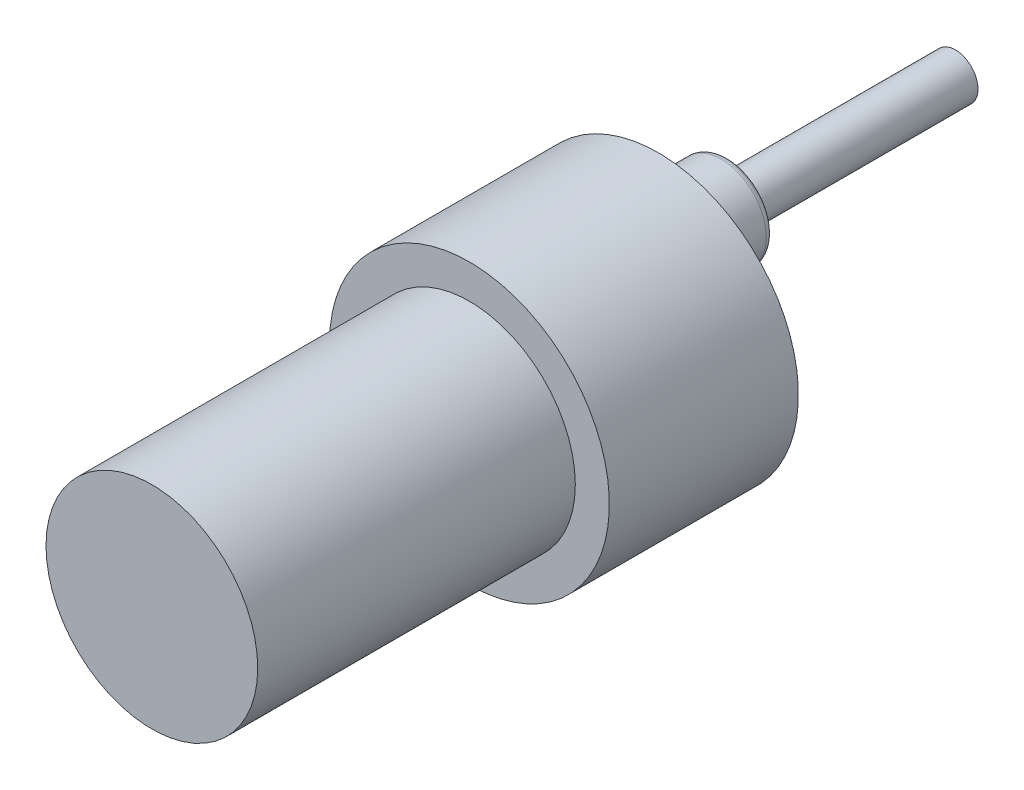
ISO-10303-21;
HEADER;
FILE_DESCRIPTION(('STEP AP214'),'2;1');
FILE_NAME('part.step','',(''),(''),'','','');
FILE_SCHEMA(('AUTOMOTIVE_DESIGN { 1 0 10303 214 1 1 1 1 }'));
ENDSEC;
DATA;
#1=APPLICATION_CONTEXT('core data for automotive mechanical design processes');
#2=APPLICATION_PROTOCOL_DEFINITION('international standard','automotive_design',2000,#1);
#3=PRODUCT_CONTEXT('',#1,'mechanical');
#4=PRODUCT('Part','Part','',(#3));
#5=PRODUCT_RELATED_PRODUCT_CATEGORY('part','',(#4));
#6=PRODUCT_DEFINITION_FORMATION('','',#4);
#7=PRODUCT_DEFINITION_CONTEXT('part definition',#1,'design');
#8=PRODUCT_DEFINITION('design','',#6,#7);
#9=PRODUCT_DEFINITION_SHAPE('','',#8);
#10=(LENGTH_UNIT() NAMED_UNIT(*) SI_UNIT(.MILLI.,.METRE.));
#11=(NAMED_UNIT(*) PLANE_ANGLE_UNIT() SI_UNIT($,.RADIAN.));
#12=(NAMED_UNIT(*) SI_UNIT($,.STERADIAN.) SOLID_ANGLE_UNIT());
#13=UNCERTAINTY_MEASURE_WITH_UNIT(LENGTH_MEASURE(1.E-05),#10,'distance_accuracy_value','');
#14=(GEOMETRIC_REPRESENTATION_CONTEXT(3) GLOBAL_UNCERTAINTY_ASSIGNED_CONTEXT((#13)) GLOBAL_UNIT_ASSIGNED_CONTEXT((#10,
#11,#12)) REPRESENTATION_CONTEXT('',''));
#15=CARTESIAN_POINT('',(0.,0.,0.));
#16=DIRECTION('',(0.,0.,1.));
#17=DIRECTION('',(1.,0.,0.));
#18=AXIS2_PLACEMENT_3D('',#15,#16,#17);
#19=CARTESIAN_POINT('',(0.,0.,0.));
#20=DIRECTION('',(0.,0.,-1.));
#21=DIRECTION('',(-1.,0.,0.));
#22=AXIS2_PLACEMENT_3D('',#19,#20,#21);
#23=CYLINDRICAL_SURFACE('',#22,18.5);
#24=CARTESIAN_POINT('',(0.,0.,0.));
#25=DIRECTION('',(0.,0.,-1.));
#26=DIRECTION('',(-1.,0.,0.));
#27=AXIS2_PLACEMENT_3D('',#24,#25,#26);
#28=CIRCLE('',#27,18.5);
#29=CARTESIAN_POINT('',(-18.5,0.,0.));
#30=VERTEX_POINT('',#29);
#31=EDGE_CURVE('E46',#30,#30,#28,.T.);
#32=ORIENTED_EDGE('',*,*,#31,.T.);
#33=EDGE_LOOP('',(#32));
#34=FACE_BOUND('',#33,.T.);
#35=CARTESIAN_POINT('',(0.,0.,-25.));
#36=DIRECTION('',(0.,0.,-1.));
#37=DIRECTION('',(-1.,0.,0.));
#38=AXIS2_PLACEMENT_3D('',#35,#36,#37);
#39=CIRCLE('',#38,18.5);
#40=CARTESIAN_POINT('',(-18.5,0.,-25.));
#41=VERTEX_POINT('',#40);
#42=EDGE_CURVE('E51',#41,#41,#39,.T.);
#43=ORIENTED_EDGE('',*,*,#42,.F.);
#44=EDGE_LOOP('',(#43));
#45=FACE_BOUND('',#44,.T.);
#46=ADVANCED_FACE('F31',(#34,#45),#23,.T.);
#47=CARTESIAN_POINT('',(18.5,0.,0.));
#48=DIRECTION('',(0.,0.,1.));
#49=DIRECTION('',(1.,0.,0.));
#50=AXIS2_PLACEMENT_3D('',#47,#48,#49);
#51=PLANE('',#50);
#52=CARTESIAN_POINT('',(0.,0.,0.));
#53=DIRECTION('',(0.,0.,1.));
#54=DIRECTION('',(1.,0.,0.));
#55=AXIS2_PLACEMENT_3D('',#52,#53,#54);
#56=CIRCLE('',#55,14.);
#57=CARTESIAN_POINT('',(-14.,0.,0.));
#58=VERTEX_POINT('',#57);
#59=EDGE_CURVE('E55',#58,#58,#56,.T.);
#60=ORIENTED_EDGE('',*,*,#59,.F.);
#61=EDGE_LOOP('',(#60));
#62=FACE_BOUND('',#61,.T.);
#63=ORIENTED_EDGE('',*,*,#31,.F.);
#64=EDGE_LOOP('',(#63));
#65=FACE_BOUND('',#64,.T.);
#66=ADVANCED_FACE('F81',(#62,#65),#51,.T.);
#67=CARTESIAN_POINT('',(0.,0.,-25.));
#68=DIRECTION('',(0.,0.,-1.));
#69=DIRECTION('',(-1.,0.,0.));
#70=AXIS2_PLACEMENT_3D('',#67,#68,#69);
#71=PLANE('',#70);
#72=CARTESIAN_POINT('',(-0.242259635763007,7.4190457114699,-25.));
#73=DIRECTION('',(0.,0.,-1.));
#74=DIRECTION('',(-1.,0.,0.));
#75=AXIS2_PLACEMENT_3D('',#72,#73,#74);
#76=CIRCLE('',#75,6.);
#77=CARTESIAN_POINT('',(-6.24225963576301,7.4190457114699,-25.));
#78=VERTEX_POINT('',#77);
#79=EDGE_CURVE('E42',#78,#78,#76,.T.);
#80=ORIENTED_EDGE('',*,*,#79,.F.);
#81=EDGE_LOOP('',(#80));
#82=FACE_BOUND('',#81,.T.);
#83=ORIENTED_EDGE('',*,*,#42,.T.);
#84=EDGE_LOOP('',(#83));
#85=FACE_BOUND('',#84,.T.);
#86=ADVANCED_FACE('F86',(#82,#85),#71,.T.);
#87=CARTESIAN_POINT('',(0.,0.,42.));
#88=DIRECTION('',(0.,0.,-1.));
#89=DIRECTION('',(-1.,0.,0.));
#90=AXIS2_PLACEMENT_3D('',#87,#88,#89);
#91=CYLINDRICAL_SURFACE('',#90,14.);
#92=CARTESIAN_POINT('',(0.,0.,42.));
#93=DIRECTION('',(0.,0.,1.));
#94=DIRECTION('',(1.,0.,0.));
#95=AXIS2_PLACEMENT_3D('',#92,#93,#94);
#96=CIRCLE('',#95,14.);
#97=CARTESIAN_POINT('',(-14.,0.,42.));
#98=VERTEX_POINT('',#97);
#99=EDGE_CURVE('E54',#98,#98,#96,.T.);
#100=CARTESIAN_POINT('',(-14.,0.,42.));
#101=CARTESIAN_POINT('',(-14.,0.,41.5625));
#102=CARTESIAN_POINT('',(-14.,0.,41.125));
#103=CARTESIAN_POINT('',(-14.,0.,40.25));
#104=CARTESIAN_POINT('',(-14.,0.,39.8125));
#105=CARTESIAN_POINT('',(-14.,0.,38.9375));
#106=CARTESIAN_POINT('',(-14.,0.,38.5));
#107=CARTESIAN_POINT('',(-14.,0.,37.625));
#108=CARTESIAN_POINT('',(-14.,0.,37.1875));
#109=CARTESIAN_POINT('',(-14.,0.,36.3125));
#110=CARTESIAN_POINT('',(-14.,0.,35.875));
#111=CARTESIAN_POINT('',(-14.,0.,35.));
#112=CARTESIAN_POINT('',(-14.,0.,34.5625));
#113=CARTESIAN_POINT('',(-14.,0.,33.6875));
#114=CARTESIAN_POINT('',(-14.,0.,33.25));
#115=CARTESIAN_POINT('',(-14.,0.,32.375));
#116=CARTESIAN_POINT('',(-14.,0.,31.9375));
#117=CARTESIAN_POINT('',(-14.,0.,31.0625));
#118=CARTESIAN_POINT('',(-14.,0.,30.625));
#119=CARTESIAN_POINT('',(-14.,0.,29.75));
#120=CARTESIAN_POINT('',(-14.,0.,29.3125));
#121=CARTESIAN_POINT('',(-14.,0.,28.4375));
#122=CARTESIAN_POINT('',(-14.,0.,28.));
#123=CARTESIAN_POINT('',(-14.,0.,27.125));
#124=CARTESIAN_POINT('',(-14.,0.,26.6875));
#125=CARTESIAN_POINT('',(-14.,0.,25.8125));
#126=CARTESIAN_POINT('',(-14.,0.,25.375));
#127=CARTESIAN_POINT('',(-14.,0.,24.5));
#128=CARTESIAN_POINT('',(-14.,0.,24.0625));
#129=CARTESIAN_POINT('',(-14.,0.,23.1875));
#130=CARTESIAN_POINT('',(-14.,0.,22.75));
#131=CARTESIAN_POINT('',(-14.,0.,21.875));
#132=CARTESIAN_POINT('',(-14.,0.,21.4375));
#133=CARTESIAN_POINT('',(-14.,0.,20.5625));
#134=CARTESIAN_POINT('',(-14.,0.,20.125));
#135=CARTESIAN_POINT('',(-14.,0.,19.25));
#136=CARTESIAN_POINT('',(-14.,0.,18.8125));
#137=CARTESIAN_POINT('',(-14.,0.,17.9375));
#138=CARTESIAN_POINT('',(-14.,0.,17.5));
#139=CARTESIAN_POINT('',(-14.,0.,16.625));
#140=CARTESIAN_POINT('',(-14.,0.,16.1875));
#141=CARTESIAN_POINT('',(-14.,0.,15.3125));
#142=CARTESIAN_POINT('',(-14.,0.,14.875));
#143=CARTESIAN_POINT('',(-14.,0.,14.));
#144=CARTESIAN_POINT('',(-14.,0.,13.5625));
#145=CARTESIAN_POINT('',(-14.,0.,12.6875));
#146=CARTESIAN_POINT('',(-14.,0.,12.25));
#147=CARTESIAN_POINT('',(-14.,0.,11.375));
#148=CARTESIAN_POINT('',(-14.,0.,10.9375));
#149=CARTESIAN_POINT('',(-14.,0.,10.0625));
#150=CARTESIAN_POINT('',(-14.,0.,9.625));
#151=CARTESIAN_POINT('',(-14.,0.,8.75));
#152=CARTESIAN_POINT('',(-14.,0.,8.3125));
#153=CARTESIAN_POINT('',(-14.,0.,7.4375));
#154=CARTESIAN_POINT('',(-14.,0.,7.));
#155=CARTESIAN_POINT('',(-14.,0.,6.125));
#156=CARTESIAN_POINT('',(-14.,0.,5.6875));
#157=CARTESIAN_POINT('',(-14.,0.,4.8125));
#158=CARTESIAN_POINT('',(-14.,0.,4.375));
#159=CARTESIAN_POINT('',(-14.,0.,3.5));
#160=CARTESIAN_POINT('',(-14.,0.,3.0625));
#161=CARTESIAN_POINT('',(-14.,0.,2.1875));
#162=CARTESIAN_POINT('',(-14.,0.,1.75));
#163=CARTESIAN_POINT('',(-14.,0.,0.875000000000001));
#164=CARTESIAN_POINT('',(-14.,0.,0.4375));
#165=CARTESIAN_POINT('',(-14.,0.,0.));
#166=B_SPLINE_CURVE_WITH_KNOTS('',3,(#100,#101,#102,#103,#104,#105,#106,#107,#108,#109,#110,
#111,#112,#113,#114,#115,#116,#117,#118,#119,#120,#121,#122,#123,#124,#125,#126,#127,#128,#129,
#130,#131,#132,#133,#134,#135,#136,#137,#138,#139,#140,#141,#142,#143,#144,#145,#146,#147,#148,
#149,#150,#151,#152,#153,#154,#155,#156,#157,#158,#159,#160,#161,#162,#163,#164,#165),
.UNSPECIFIED.,.F.,.F.,(4,2,2,2,2,2,2,2,2,2,2,2,2,2,2,2,2,2,2,2,2,2,2,2,2,2,2,2,2,2,2,2,4),(0.,
1.31249999999999,2.625,3.9375,5.25,6.5625,7.87499999999999,9.18749999999999,10.5,11.8125,13.125,
14.4375,15.75,17.0625,18.375,19.6875,21.,22.3125,23.625,24.9375,26.25,27.5625,28.875,30.1875,
31.5,32.8125,34.125,35.4375,36.75,38.0625,39.375,40.6875,42.),.UNSPECIFIED.);
#167=EDGE_CURVE('BSEAM93',#98,#58,#166,.T.);
#168=ORIENTED_EDGE('',*,*,#99,.F.);
#169=ORIENTED_EDGE('',*,*,#59,.T.);
#170=ORIENTED_EDGE('',*,*,#167,.T.);
#171=ORIENTED_EDGE('',*,*,#167,.F.);
#172=EDGE_LOOP('',(#168,#170,#169,#171));
#173=FACE_BOUND('',#172,.T.);
#174=ADVANCED_FACE('F93',(#173),#91,.T.);
#175=CARTESIAN_POINT('',(0.,0.,42.));
#176=DIRECTION('',(0.,0.,1.));
#177=DIRECTION('',(1.,0.,0.));
#178=AXIS2_PLACEMENT_3D('',#175,#176,#177);
#179=PLANE('',#178);
#180=ORIENTED_EDGE('',*,*,#99,.T.);
#181=EDGE_LOOP('',(#180));
#182=FACE_BOUND('',#181,.T.);
#183=ADVANCED_FACE('F97',(#182),#179,.T.);
#184=CARTESIAN_POINT('',(-0.242259635763007,7.4190457114699,-25.));
#185=DIRECTION('',(0.,0.,-1.));
#186=DIRECTION('',(-1.,0.,0.));
#187=AXIS2_PLACEMENT_3D('',#184,#185,#186);
#188=CYLINDRICAL_SURFACE('',#187,6.);
#189=CARTESIAN_POINT('',(-0.242259635763007,7.4190457114699,-33.5));
#190=DIRECTION('',(0.,0.,-1.));
#191=DIRECTION('',(-1.,0.,0.));
#192=AXIS2_PLACEMENT_3D('',#189,#190,#191);
#193=CIRCLE('',#192,6.);
#194=CARTESIAN_POINT('',(-6.24225963576301,7.4190457114699,-33.5));
#195=VERTEX_POINT('',#194);
#196=EDGE_CURVE('E10',#195,#195,#193,.F.);
#197=ORIENTED_EDGE('',*,*,#196,.T.);
#198=EDGE_LOOP('',(#197));
#199=FACE_BOUND('',#198,.T.);
#200=ORIENTED_EDGE('',*,*,#79,.T.);
#201=EDGE_LOOP('',(#200));
#202=FACE_BOUND('',#201,.T.);
#203=ADVANCED_FACE('F101',(#199,#202),#188,.T.);
#204=CARTESIAN_POINT('',(-0.242259635763007,7.4190457114699,-64.5));
#205=DIRECTION('',(0.,0.,-1.));
#206=DIRECTION('',(-1.,0.,0.));
#207=AXIS2_PLACEMENT_3D('',#204,#205,#206);
#208=PLANE('',#207);
#209=CARTESIAN_POINT('',(-0.242259635763007,7.4190457114699,-64.5));
#210=DIRECTION('',(0.,0.,-1.));
#211=DIRECTION('',(-1.,0.,0.));
#212=AXIS2_PLACEMENT_3D('',#209,#210,#211);
#213=CIRCLE('',#212,3.);
#214=CARTESIAN_POINT('',(-3.24225963576301,7.4190457114699,-64.5));
#215=VERTEX_POINT('',#214);
#216=EDGE_CURVE('E58',#215,#215,#213,.T.);
#217=ORIENTED_EDGE('',*,*,#216,.T.);
#218=EDGE_LOOP('',(#217));
#219=FACE_BOUND('',#218,.T.);
#220=ADVANCED_FACE('F78',(#219),#208,.T.);
#221=CARTESIAN_POINT('',(-0.242259635763007,7.4190457114699,-25.));
#222=DIRECTION('',(0.,0.,-1.));
#223=DIRECTION('',(-1.,0.,0.));
#224=AXIS2_PLACEMENT_3D('',#221,#222,#223);
#225=CYLINDRICAL_SURFACE('',#224,3.);
#226=CARTESIAN_POINT('',(-0.242259635763007,7.4190457114699,-34.5));
#227=DIRECTION('',(0.,0.,-1.));
#228=DIRECTION('',(-1.,0.,0.));
#229=AXIS2_PLACEMENT_3D('',#226,#227,#228);
#230=CIRCLE('',#229,3.);
#231=CARTESIAN_POINT('',(-3.24225963576301,7.4190457114699,-34.5));
#232=VERTEX_POINT('',#231);
#233=EDGE_CURVE('E63',#232,#232,#230,.T.);
#234=ORIENTED_EDGE('',*,*,#233,.T.);
#235=EDGE_LOOP('',(#234));
#236=FACE_BOUND('',#235,.T.);
#237=ORIENTED_EDGE('',*,*,#216,.F.);
#238=EDGE_LOOP('',(#237));
#239=FACE_BOUND('',#238,.T.);
#240=ADVANCED_FACE('F67',(#236,#239),#225,.T.);
#241=CARTESIAN_POINT('',(2.75774036423699,7.4190457114699,-34.5));
#242=DIRECTION('',(0.,0.,-1.));
#243=DIRECTION('',(-1.,0.,0.));
#244=AXIS2_PLACEMENT_3D('',#241,#242,#243);
#245=PLANE('',#244);
#246=CARTESIAN_POINT('',(-0.242259635763007,7.4190457114699,-34.5));
#247=DIRECTION('',(0.,0.,-1.));
#248=DIRECTION('',(-1.,0.,0.));
#249=AXIS2_PLACEMENT_3D('',#246,#247,#248);
#250=CIRCLE('',#249,5.);
#251=CARTESIAN_POINT('',(-5.24225963576301,7.4190457114699,-34.5));
#252=VERTEX_POINT('',#251);
#253=EDGE_CURVE('E38',#252,#252,#250,.T.);
#254=ORIENTED_EDGE('',*,*,#253,.T.);
#255=EDGE_LOOP('',(#254));
#256=FACE_BOUND('',#255,.T.);
#257=ORIENTED_EDGE('',*,*,#233,.F.);
#258=EDGE_LOOP('',(#257));
#259=FACE_BOUND('',#258,.T.);
#260=ADVANCED_FACE('F70',(#256,#259),#245,.T.);
#261=CARTESIAN_POINT('',(-0.242259635763007,7.4190457114699,-33.5));
#262=DIRECTION('',(0.,0.,-1.));
#263=DIRECTION('',(-1.,0.,0.));
#264=AXIS2_PLACEMENT_3D('',#261,#262,#263);
#265=TOROIDAL_SURFACE('',#264,5.,1.);
#266=ORIENTED_EDGE('',*,*,#196,.F.);
#267=EDGE_LOOP('',(#266));
#268=FACE_BOUND('',#267,.T.);
#269=ORIENTED_EDGE('',*,*,#253,.F.);
#270=EDGE_LOOP('',(#269));
#271=FACE_BOUND('',#270,.T.);
#272=ADVANCED_FACE('F33',(#268,#271),#265,.T.);
#273=CLOSED_SHELL('',(#46,#66,#86,#174,#183,#203,#220,#240,#260,#272));
#274=MANIFOLD_SOLID_BREP('B2',#273);
#275=ADVANCED_BREP_SHAPE_REPRESENTATION('',(#18,#274),#14);
#276=SHAPE_DEFINITION_REPRESENTATION(#9,#275);
ENDSEC;
END-ISO-10303-21;
